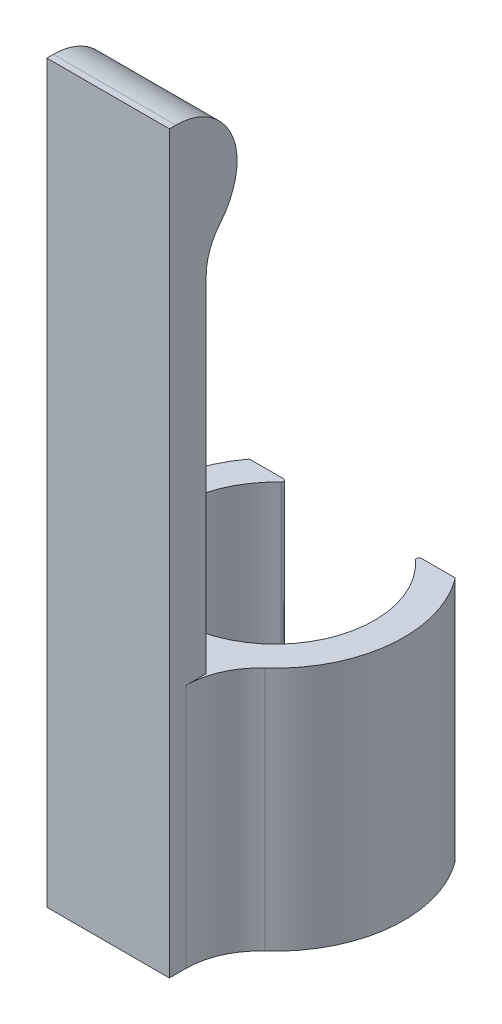
ISO-10303-21;
HEADER;
FILE_DESCRIPTION(('STEP AP214'),'2;1');
FILE_NAME('part.step','',(''),(''),'','','');
FILE_SCHEMA(('AUTOMOTIVE_DESIGN { 1 0 10303 214 1 1 1 1 }'));
ENDSEC;
DATA;
#1=APPLICATION_CONTEXT('core data for automotive mechanical design processes');
#2=APPLICATION_PROTOCOL_DEFINITION('international standard','automotive_design',2000,#1);
#3=PRODUCT_CONTEXT('',#1,'mechanical');
#4=PRODUCT('Part','Part','',(#3));
#5=PRODUCT_RELATED_PRODUCT_CATEGORY('part','',(#4));
#6=PRODUCT_DEFINITION_FORMATION('','',#4);
#7=PRODUCT_DEFINITION_CONTEXT('part definition',#1,'design');
#8=PRODUCT_DEFINITION('design','',#6,#7);
#9=PRODUCT_DEFINITION_SHAPE('','',#8);
#10=(LENGTH_UNIT() NAMED_UNIT(*) SI_UNIT(.MILLI.,.METRE.));
#11=(NAMED_UNIT(*) PLANE_ANGLE_UNIT() SI_UNIT($,.RADIAN.));
#12=(NAMED_UNIT(*) SI_UNIT($,.STERADIAN.) SOLID_ANGLE_UNIT());
#13=UNCERTAINTY_MEASURE_WITH_UNIT(LENGTH_MEASURE(1.E-05),#10,'distance_accuracy_value','');
#14=(GEOMETRIC_REPRESENTATION_CONTEXT(3) GLOBAL_UNCERTAINTY_ASSIGNED_CONTEXT((#13)) GLOBAL_UNIT_ASSIGNED_CONTEXT((#10,
#11,#12)) REPRESENTATION_CONTEXT('',''));
#15=CARTESIAN_POINT('',(0.,0.,0.));
#16=DIRECTION('',(0.,0.,1.));
#17=DIRECTION('',(1.,0.,0.));
#18=AXIS2_PLACEMENT_3D('',#15,#16,#17);
#19=CARTESIAN_POINT('',(0.,30.,5.31654632815485));
#20=DIRECTION('',(0.,0.,-1.));
#21=DIRECTION('',(-1.,0.,0.));
#22=AXIS2_PLACEMENT_3D('',#19,#20,#21);
#23=PLANE('',#22);
#24=DIRECTION('',(0.,-1.,0.));
#25=VECTOR('',#24,1.);
#26=CARTESIAN_POINT('',(-2.5,30.,5.31654632815485));
#27=LINE('',#26,#25);
#28=CARTESIAN_POINT('',(-2.5,24.0403961705515,5.31654632815485));
#29=VERTEX_POINT('',#28);
#30=CARTESIAN_POINT('',(-2.5,10.,5.31654632815485));
#31=VERTEX_POINT('',#30);
#32=EDGE_CURVE('E214',#29,#31,#27,.T.);
#33=ORIENTED_EDGE('',*,*,#32,.F.);
#34=DIRECTION('',(1.,0.,0.));
#35=VECTOR('',#34,1.);
#36=CARTESIAN_POINT('',(0.,24.0403961705515,5.31654632815485));
#37=LINE('',#36,#35);
#38=CARTESIAN_POINT('',(2.5,24.0403961705515,5.31654632815485));
#39=VERTEX_POINT('',#38);
#40=EDGE_CURVE('E300',#29,#39,#37,.T.);
#41=ORIENTED_EDGE('',*,*,#40,.T.);
#42=DIRECTION('',(0.,-1.,0.));
#43=VECTOR('',#42,1.);
#44=CARTESIAN_POINT('',(2.5,30.,5.31654632815485));
#45=LINE('',#44,#43);
#46=CARTESIAN_POINT('',(2.5,10.,5.31654632815485));
#47=VERTEX_POINT('',#46);
#48=EDGE_CURVE('E208',#39,#47,#45,.T.);
#49=ORIENTED_EDGE('',*,*,#48,.T.);
#50=DIRECTION('',(-1.,0.,0.));
#51=VECTOR('',#50,1.);
#52=CARTESIAN_POINT('',(0.,10.,5.31654632815485));
#53=LINE('',#52,#51);
#54=EDGE_CURVE('E225',#47,#31,#53,.T.);
#55=ORIENTED_EDGE('',*,*,#54,.T.);
#56=EDGE_LOOP('',(#33,#41,#49,#55));
#57=FACE_BOUND('',#56,.T.);
#58=ADVANCED_FACE('F43',(#57),#23,.T.);
#59=CARTESIAN_POINT('',(0.,10.,0.));
#60=DIRECTION('',(0.,1.,0.));
#61=DIRECTION('',(0.,0.,1.));
#62=AXIS2_PLACEMENT_3D('',#59,#60,#61);
#63=PLANE('',#62);
#64=CARTESIAN_POINT('',(0.,10.,0.));
#65=DIRECTION('',(0.,1.,0.));
#66=DIRECTION('',(0.,0.,1.));
#67=AXIS2_PLACEMENT_3D('',#64,#65,#66);
#68=CIRCLE('',#67,5.25);
#69=CARTESIAN_POINT('',(3.5,10.,3.91311896062463));
#70=VERTEX_POINT('',#69);
#71=CARTESIAN_POINT('',(4.2302754596716,10.,-3.10922330097087));
#72=VERTEX_POINT('',#71);
#73=EDGE_CURVE('E230',#70,#72,#68,.T.);
#74=ORIENTED_EDGE('',*,*,#73,.T.);
#75=CARTESIAN_POINT('',(4.14969878424928,10.,-3.05));
#76=DIRECTION('',(0.,1.,0.));
#77=DIRECTION('',(0.,0.,1.));
#78=AXIS2_PLACEMENT_3D('',#75,#76,#77);
#79=CIRCLE('',#78,0.1);
#80=CARTESIAN_POINT('',(4.14969878424928,10.,-3.15));
#81=VERTEX_POINT('',#80);
#82=EDGE_CURVE('E355',#72,#81,#79,.T.);
#83=ORIENTED_EDGE('',*,*,#82,.T.);
#84=DIRECTION('',(1.,0.,0.));
#85=VECTOR('',#84,1.);
#86=CARTESIAN_POINT('',(0.,10.,-3.15));
#87=LINE('',#86,#85);
#88=CARTESIAN_POINT('',(2.81424945589406,10.,-3.15));
#89=VERTEX_POINT('',#88);
#90=EDGE_CURVE('E234',#89,#81,#87,.T.);
#91=ORIENTED_EDGE('',*,*,#90,.F.);
#92=CARTESIAN_POINT('',(2.81424945589406,10.,-3.05));
#93=DIRECTION('',(0.,1.,0.));
#94=DIRECTION('',(0.,0.,1.));
#95=AXIS2_PLACEMENT_3D('',#92,#93,#94);
#96=CIRCLE('',#95,0.1);
#97=CARTESIAN_POINT('',(2.746436215993,10.,-2.97650602409639));
#98=VERTEX_POINT('',#97);
#99=EDGE_CURVE('E347',#89,#98,#96,.T.);
#100=ORIENTED_EDGE('',*,*,#99,.T.);
#101=CARTESIAN_POINT('',(0.,10.,0.));
#102=DIRECTION('',(0.,1.,0.));
#103=DIRECTION('',(0.,0.,1.));
#104=AXIS2_PLACEMENT_3D('',#101,#102,#103);
#105=CIRCLE('',#104,4.05);
#106=CARTESIAN_POINT('',(-2.746436215993,10.,-2.97650602409639));
#107=VERTEX_POINT('',#106);
#108=EDGE_CURVE('E240',#107,#98,#105,.T.);
#109=ORIENTED_EDGE('',*,*,#108,.F.);
#110=CARTESIAN_POINT('',(-2.81424945589406,10.,-3.05));
#111=DIRECTION('',(0.,1.,0.));
#112=DIRECTION('',(0.,0.,1.));
#113=AXIS2_PLACEMENT_3D('',#110,#111,#112);
#114=CIRCLE('',#113,0.1);
#115=CARTESIAN_POINT('',(-2.81424945589406,10.,-3.15));
#116=VERTEX_POINT('',#115);
#117=EDGE_CURVE('E350',#107,#116,#114,.T.);
#118=ORIENTED_EDGE('',*,*,#117,.T.);
#119=DIRECTION('',(-1.,0.,0.));
#120=VECTOR('',#119,1.);
#121=CARTESIAN_POINT('',(0.,10.,-3.15));
#122=LINE('',#121,#120);
#123=CARTESIAN_POINT('',(-4.14969878424928,10.,-3.15));
#124=VERTEX_POINT('',#123);
#125=EDGE_CURVE('E244',#116,#124,#122,.T.);
#126=ORIENTED_EDGE('',*,*,#125,.T.);
#127=CARTESIAN_POINT('',(-4.14969878424928,10.,-3.05));
#128=DIRECTION('',(0.,1.,0.));
#129=DIRECTION('',(0.,0.,1.));
#130=AXIS2_PLACEMENT_3D('',#127,#128,#129);
#131=CIRCLE('',#130,0.1);
#132=CARTESIAN_POINT('',(-4.2302754596716,10.,-3.10922330097087));
#133=VERTEX_POINT('',#132);
#134=EDGE_CURVE('E59',#124,#133,#131,.T.);
#135=ORIENTED_EDGE('',*,*,#134,.T.);
#136=CARTESIAN_POINT('',(-3.5,10.,3.91311896062463));
#137=VERTEX_POINT('',#136);
#138=EDGE_CURVE('E236',#133,#137,#68,.T.);
#139=ORIENTED_EDGE('',*,*,#138,.T.);
#140=CARTESIAN_POINT('',(-5.5,10.,6.14918693812442));
#141=DIRECTION('',(0.,1.,0.));
#142=DIRECTION('',(0.,0.,1.));
#143=AXIS2_PLACEMENT_3D('',#140,#141,#142);
#144=CIRCLE('',#143,3.);
#145=CARTESIAN_POINT('',(-2.5,10.,6.14918693812442));
#146=VERTEX_POINT('',#145);
#147=EDGE_CURVE('E297',#137,#146,#144,.F.);
#148=ORIENTED_EDGE('',*,*,#147,.T.);
#149=DIRECTION('',(0.,0.,-1.));
#150=VECTOR('',#149,1.);
#151=CARTESIAN_POINT('',(-2.5,10.,0.));
#152=LINE('',#151,#150);
#153=EDGE_CURVE('E217',#146,#31,#152,.T.);
#154=ORIENTED_EDGE('',*,*,#153,.T.);
#155=ORIENTED_EDGE('',*,*,#54,.F.);
#156=DIRECTION('',(0.,0.,1.));
#157=VECTOR('',#156,1.);
#158=CARTESIAN_POINT('',(2.5,10.,0.));
#159=LINE('',#158,#157);
#160=CARTESIAN_POINT('',(2.5,10.,6.14918693812442));
#161=VERTEX_POINT('',#160);
#162=EDGE_CURVE('E221',#47,#161,#159,.T.);
#163=ORIENTED_EDGE('',*,*,#162,.T.);
#164=CARTESIAN_POINT('',(5.5,10.,6.14918693812442));
#165=DIRECTION('',(0.,1.,0.));
#166=DIRECTION('',(0.,0.,1.));
#167=AXIS2_PLACEMENT_3D('',#164,#165,#166);
#168=CIRCLE('',#167,3.);
#169=EDGE_CURVE('E290',#161,#70,#168,.F.);
#170=ORIENTED_EDGE('',*,*,#169,.T.);
#171=EDGE_LOOP('',(#74,#83,#91,#100,#109,#118,#126,#135,#139,#148,#154,#155,#163,#170));
#172=FACE_BOUND('',#171,.T.);
#173=ADVANCED_FACE('F386',(#172),#63,.T.);
#174=CARTESIAN_POINT('',(0.,10.,0.));
#175=DIRECTION('',(0.,-1.,0.));
#176=DIRECTION('',(0.,0.,-1.));
#177=AXIS2_PLACEMENT_3D('',#174,#175,#176);
#178=CYLINDRICAL_SURFACE('',#177,5.25);
#179=CARTESIAN_POINT('',(0.,0.,0.));
#180=DIRECTION('',(0.,1.,0.));
#181=DIRECTION('',(0.,0.,1.));
#182=AXIS2_PLACEMENT_3D('',#179,#180,#181);
#183=CIRCLE('',#182,5.25);
#184=CARTESIAN_POINT('',(3.5,0.,3.91311896062463));
#185=VERTEX_POINT('',#184);
#186=CARTESIAN_POINT('',(4.2302754596716,0.,-3.10922330097087));
#187=VERTEX_POINT('',#186);
#188=EDGE_CURVE('E247',#185,#187,#183,.T.);
#189=ORIENTED_EDGE('',*,*,#188,.T.);
#190=DIRECTION('',(0.,-1.,0.));
#191=VECTOR('',#190,1.);
#192=CARTESIAN_POINT('',(4.2302754596716,10.,-3.10922330097087));
#193=LINE('',#192,#191);
#194=EDGE_CURVE('E344',#187,#72,#193,.F.);
#195=ORIENTED_EDGE('',*,*,#194,.T.);
#196=ORIENTED_EDGE('',*,*,#73,.F.);
#197=DIRECTION('',(0.,-1.,0.));
#198=VECTOR('',#197,1.);
#199=CARTESIAN_POINT('',(3.5,10.,3.91311896062463));
#200=LINE('',#199,#198);
#201=EDGE_CURVE('E272',#70,#185,#200,.T.);
#202=ORIENTED_EDGE('',*,*,#201,.T.);
#203=EDGE_LOOP('',(#189,#195,#196,#202));
#204=FACE_BOUND('',#203,.T.);
#205=ADVANCED_FACE('F417',(#204),#178,.T.);
#206=CARTESIAN_POINT('',(0.,10.,-3.15));
#207=DIRECTION('',(0.,0.,-1.));
#208=DIRECTION('',(-1.,0.,0.));
#209=AXIS2_PLACEMENT_3D('',#206,#207,#208);
#210=PLANE('',#209);
#211=ORIENTED_EDGE('',*,*,#90,.T.);
#212=DIRECTION('',(0.,1.,0.));
#213=VECTOR('',#212,1.);
#214=CARTESIAN_POINT('',(4.14969878424928,0.,-3.15));
#215=LINE('',#214,#213);
#216=CARTESIAN_POINT('',(4.14969878424928,0.,-3.15));
#217=VERTEX_POINT('',#216);
#218=EDGE_CURVE('E328',#81,#217,#215,.F.);
#219=ORIENTED_EDGE('',*,*,#218,.T.);
#220=DIRECTION('',(1.,0.,0.));
#221=VECTOR('',#220,1.);
#222=CARTESIAN_POINT('',(0.,0.,-3.15));
#223=LINE('',#222,#221);
#224=CARTESIAN_POINT('',(2.81424945589406,0.,-3.15));
#225=VERTEX_POINT('',#224);
#226=EDGE_CURVE('E251',#225,#217,#223,.T.);
#227=ORIENTED_EDGE('',*,*,#226,.F.);
#228=DIRECTION('',(0.,-1.,0.));
#229=VECTOR('',#228,1.);
#230=CARTESIAN_POINT('',(2.81424945589406,10.,-3.15));
#231=LINE('',#230,#229);
#232=EDGE_CURVE('E325',#225,#89,#231,.F.);
#233=ORIENTED_EDGE('',*,*,#232,.T.);
#234=EDGE_LOOP('',(#211,#219,#227,#233));
#235=FACE_BOUND('',#234,.T.);
#236=ADVANCED_FACE('F462',(#235),#210,.T.);
#237=CARTESIAN_POINT('',(0.,10.,0.));
#238=DIRECTION('',(0.,-1.,0.));
#239=DIRECTION('',(0.,0.,-1.));
#240=AXIS2_PLACEMENT_3D('',#237,#238,#239);
#241=CYLINDRICAL_SURFACE('',#240,4.05);
#242=CARTESIAN_POINT('',(0.,0.,0.));
#243=DIRECTION('',(0.,1.,0.));
#244=DIRECTION('',(0.,0.,1.));
#245=AXIS2_PLACEMENT_3D('',#242,#243,#244);
#246=CIRCLE('',#245,4.05);
#247=CARTESIAN_POINT('',(-2.746436215993,0.,-2.97650602409639));
#248=VERTEX_POINT('',#247);
#249=CARTESIAN_POINT('',(2.746436215993,0.,-2.97650602409639));
#250=VERTEX_POINT('',#249);
#251=EDGE_CURVE('E255',#248,#250,#246,.T.);
#252=ORIENTED_EDGE('',*,*,#251,.F.);
#253=DIRECTION('',(0.,-1.,0.));
#254=VECTOR('',#253,1.);
#255=CARTESIAN_POINT('',(-2.746436215993,10.,-2.97650602409639));
#256=LINE('',#255,#254);
#257=EDGE_CURVE('E11',#248,#107,#256,.F.);
#258=ORIENTED_EDGE('',*,*,#257,.T.);
#259=ORIENTED_EDGE('',*,*,#108,.T.);
#260=DIRECTION('',(0.,-1.,0.));
#261=VECTOR('',#260,1.);
#262=CARTESIAN_POINT('',(2.746436215993,10.,-2.97650602409639));
#263=LINE('',#262,#261);
#264=EDGE_CURVE('E52',#98,#250,#263,.T.);
#265=ORIENTED_EDGE('',*,*,#264,.T.);
#266=EDGE_LOOP('',(#252,#258,#259,#265));
#267=FACE_BOUND('',#266,.T.);
#268=ADVANCED_FACE('F372',(#267),#241,.F.);
#269=CARTESIAN_POINT('',(0.,10.,-3.15));
#270=DIRECTION('',(0.,0.,1.));
#271=DIRECTION('',(1.,0.,0.));
#272=AXIS2_PLACEMENT_3D('',#269,#270,#271);
#273=PLANE('',#272);
#274=DIRECTION('',(-1.,0.,0.));
#275=VECTOR('',#274,1.);
#276=CARTESIAN_POINT('',(0.,0.,-3.15));
#277=LINE('',#276,#275);
#278=CARTESIAN_POINT('',(-2.81424945589406,0.,-3.15));
#279=VERTEX_POINT('',#278);
#280=CARTESIAN_POINT('',(-4.14969878424928,0.,-3.15));
#281=VERTEX_POINT('',#280);
#282=EDGE_CURVE('E259',#279,#281,#277,.T.);
#283=ORIENTED_EDGE('',*,*,#282,.T.);
#284=DIRECTION('',(0.,-1.,0.));
#285=VECTOR('',#284,1.);
#286=CARTESIAN_POINT('',(-4.14969878424928,10.,-3.15));
#287=LINE('',#286,#285);
#288=EDGE_CURVE('E67',#281,#124,#287,.F.);
#289=ORIENTED_EDGE('',*,*,#288,.T.);
#290=ORIENTED_EDGE('',*,*,#125,.F.);
#291=DIRECTION('',(0.,1.,0.));
#292=VECTOR('',#291,1.);
#293=CARTESIAN_POINT('',(-2.81424945589406,0.,-3.15));
#294=LINE('',#293,#292);
#295=EDGE_CURVE('E362',#116,#279,#294,.F.);
#296=ORIENTED_EDGE('',*,*,#295,.T.);
#297=EDGE_LOOP('',(#283,#289,#290,#296));
#298=FACE_BOUND('',#297,.T.);
#299=ADVANCED_FACE('F385',(#298),#273,.F.);
#300=ORIENTED_EDGE('',*,*,#138,.F.);
#301=DIRECTION('',(0.,-1.,0.));
#302=VECTOR('',#301,1.);
#303=CARTESIAN_POINT('',(-4.2302754596716,10.,-3.10922330097087));
#304=LINE('',#303,#302);
#305=CARTESIAN_POINT('',(-4.2302754596716,0.,-3.10922330097087));
#306=VERTEX_POINT('',#305);
#307=EDGE_CURVE('E358',#133,#306,#304,.T.);
#308=ORIENTED_EDGE('',*,*,#307,.T.);
#309=CARTESIAN_POINT('',(-3.5,0.,3.91311896062463));
#310=VERTEX_POINT('',#309);
#311=EDGE_CURVE('E235',#306,#310,#183,.T.);
#312=ORIENTED_EDGE('',*,*,#311,.T.);
#313=DIRECTION('',(0.,-1.,0.));
#314=VECTOR('',#313,1.);
#315=CARTESIAN_POINT('',(-3.5,10.,3.91311896062463));
#316=LINE('',#315,#314);
#317=EDGE_CURVE('E283',#310,#137,#316,.F.);
#318=ORIENTED_EDGE('',*,*,#317,.T.);
#319=EDGE_LOOP('',(#300,#308,#312,#318));
#320=FACE_BOUND('',#319,.T.);
#321=ADVANCED_FACE('F392',(#320),#178,.T.);
#322=CARTESIAN_POINT('',(0.,0.,0.));
#323=DIRECTION('',(0.,1.,0.));
#324=DIRECTION('',(0.,0.,1.));
#325=AXIS2_PLACEMENT_3D('',#322,#323,#324);
#326=PLANE('',#325);
#327=ORIENTED_EDGE('',*,*,#226,.T.);
#328=CARTESIAN_POINT('',(4.14969878424928,0.,-3.05));
#329=DIRECTION('',(0.,1.,0.));
#330=DIRECTION('',(0.,0.,1.));
#331=AXIS2_PLACEMENT_3D('',#328,#329,#330);
#332=CIRCLE('',#331,0.1);
#333=EDGE_CURVE('E341',#217,#187,#332,.F.);
#334=ORIENTED_EDGE('',*,*,#333,.T.);
#335=ORIENTED_EDGE('',*,*,#188,.F.);
#336=CARTESIAN_POINT('',(5.5,0.,6.14918693812442));
#337=DIRECTION('',(0.,1.,0.));
#338=DIRECTION('',(0.,0.,1.));
#339=AXIS2_PLACEMENT_3D('',#336,#337,#338);
#340=CIRCLE('',#339,3.);
#341=CARTESIAN_POINT('',(2.5,0.,6.14918693812442));
#342=VERTEX_POINT('',#341);
#343=EDGE_CURVE('E287',#185,#342,#340,.T.);
#344=ORIENTED_EDGE('',*,*,#343,.T.);
#345=DIRECTION('',(0.,0.,-1.));
#346=VECTOR('',#345,1.);
#347=CARTESIAN_POINT('',(2.5,0.,6.81654632815484));
#348=LINE('',#347,#346);
#349=CARTESIAN_POINT('',(2.5,0.,6.81654632815484));
#350=VERTEX_POINT('',#349);
#351=EDGE_CURVE('E264',#350,#342,#348,.T.);
#352=ORIENTED_EDGE('',*,*,#351,.F.);
#353=DIRECTION('',(1.,0.,0.));
#354=VECTOR('',#353,1.);
#355=CARTESIAN_POINT('',(-2.5,0.,6.81654632815485));
#356=LINE('',#355,#354);
#357=CARTESIAN_POINT('',(-2.5,0.,6.81654632815485));
#358=VERTEX_POINT('',#357);
#359=EDGE_CURVE('E229',#358,#350,#356,.T.);
#360=ORIENTED_EDGE('',*,*,#359,.F.);
#361=DIRECTION('',(0.,0.,1.));
#362=VECTOR('',#361,1.);
#363=CARTESIAN_POINT('',(-2.5,0.,4.61654632815485));
#364=LINE('',#363,#362);
#365=CARTESIAN_POINT('',(-2.5,0.,6.14918693812442));
#366=VERTEX_POINT('',#365);
#367=EDGE_CURVE('E195',#366,#358,#364,.T.);
#368=ORIENTED_EDGE('',*,*,#367,.F.);
#369=CARTESIAN_POINT('',(-5.5,0.,6.14918693812442));
#370=DIRECTION('',(0.,1.,0.));
#371=DIRECTION('',(0.,0.,1.));
#372=AXIS2_PLACEMENT_3D('',#369,#370,#371);
#373=CIRCLE('',#372,3.);
#374=EDGE_CURVE('E293',#366,#310,#373,.T.);
#375=ORIENTED_EDGE('',*,*,#374,.T.);
#376=ORIENTED_EDGE('',*,*,#311,.F.);
#377=CARTESIAN_POINT('',(-4.14969878424928,0.,-3.05));
#378=DIRECTION('',(0.,1.,0.));
#379=DIRECTION('',(0.,0.,1.));
#380=AXIS2_PLACEMENT_3D('',#377,#378,#379);
#381=CIRCLE('',#380,0.1);
#382=EDGE_CURVE('E338',#306,#281,#381,.F.);
#383=ORIENTED_EDGE('',*,*,#382,.T.);
#384=ORIENTED_EDGE('',*,*,#282,.F.);
#385=CARTESIAN_POINT('',(-2.81424945589406,0.,-3.05));
#386=DIRECTION('',(0.,1.,0.));
#387=DIRECTION('',(0.,0.,1.));
#388=AXIS2_PLACEMENT_3D('',#385,#386,#387);
#389=CIRCLE('',#388,0.1);
#390=EDGE_CURVE('E335',#279,#248,#389,.F.);
#391=ORIENTED_EDGE('',*,*,#390,.T.);
#392=ORIENTED_EDGE('',*,*,#251,.T.);
#393=CARTESIAN_POINT('',(2.81424945589406,0.,-3.05));
#394=DIRECTION('',(0.,1.,0.));
#395=DIRECTION('',(0.,0.,1.));
#396=AXIS2_PLACEMENT_3D('',#393,#394,#395);
#397=CIRCLE('',#396,0.1);
#398=EDGE_CURVE('E332',#250,#225,#397,.F.);
#399=ORIENTED_EDGE('',*,*,#398,.T.);
#400=EDGE_LOOP('',(#327,#334,#335,#344,#352,#360,#368,#375,#376,#383,#384,#391,#392,#399));
#401=FACE_BOUND('',#400,.T.);
#402=ADVANCED_FACE('F378',(#401),#326,.F.);
#403=CARTESIAN_POINT('',(2.5,10.,6.81654632815484));
#404=DIRECTION('',(-1.,0.,0.));
#405=DIRECTION('',(0.,0.,1.));
#406=AXIS2_PLACEMENT_3D('',#403,#404,#405);
#407=PLANE('',#406);
#408=CARTESIAN_POINT('',(2.5,27.551502834887,7.05));
#409=DIRECTION('',(-1.,0.,0.));
#410=DIRECTION('',(0.,0.,1.));
#411=AXIS2_PLACEMENT_3D('',#408,#409,#410);
#412=CIRCLE('',#411,3.);
#413=CARTESIAN_POINT('',(2.5,27.2424858255652,4.06595769333781));
#414=VERTEX_POINT('',#413);
#415=CARTESIAN_POINT('',(2.5,25.6363537452495,4.74084345172083));
#416=VERTEX_POINT('',#415);
#417=EDGE_CURVE('E431',#414,#416,#412,.T.);
#418=ORIENTED_EDGE('',*,*,#417,.F.);
#419=CARTESIAN_POINT('',(2.5,27.5,6.5526596155563));
#420=DIRECTION('',(-1.,0.,0.));
#421=DIRECTION('',(0.,0.,1.));
#422=AXIS2_PLACEMENT_3D('',#419,#420,#421);
#423=CIRCLE('',#422,2.5);
#424=CARTESIAN_POINT('',(2.5,30.,6.5526596155563));
#425=VERTEX_POINT('',#424);
#426=EDGE_CURVE('E311',#414,#425,#423,.F.);
#427=ORIENTED_EDGE('',*,*,#426,.T.);
#428=DIRECTION('',(0.,0.,-1.));
#429=VECTOR('',#428,1.);
#430=CARTESIAN_POINT('',(2.5,30.,0.));
#431=LINE('',#430,#429);
#432=CARTESIAN_POINT('',(2.5,30.,6.81654632815484));
#433=VERTEX_POINT('',#432);
#434=EDGE_CURVE('E205',#433,#425,#431,.T.);
#435=ORIENTED_EDGE('',*,*,#434,.F.);
#436=DIRECTION('',(0.,-1.,0.));
#437=VECTOR('',#436,1.);
#438=CARTESIAN_POINT('',(2.5,10.,6.81654632815484));
#439=LINE('',#438,#437);
#440=EDGE_CURVE('E200',#433,#350,#439,.T.);
#441=ORIENTED_EDGE('',*,*,#440,.T.);
#442=ORIENTED_EDGE('',*,*,#351,.T.);
#443=DIRECTION('',(0.,1.,0.));
#444=VECTOR('',#443,1.);
#445=CARTESIAN_POINT('',(2.5,10.,6.14918693812442));
#446=LINE('',#445,#444);
#447=EDGE_CURVE('E276',#342,#161,#446,.T.);
#448=ORIENTED_EDGE('',*,*,#447,.T.);
#449=ORIENTED_EDGE('',*,*,#162,.F.);
#450=ORIENTED_EDGE('',*,*,#48,.F.);
#451=CARTESIAN_POINT('',(2.5,24.0403961705515,2.81654632815484));
#452=DIRECTION('',(-1.,0.,0.));
#453=DIRECTION('',(0.,0.,1.));
#454=AXIS2_PLACEMENT_3D('',#451,#452,#453);
#455=CIRCLE('',#454,2.5);
#456=EDGE_CURVE('E319',#39,#416,#455,.T.);
#457=ORIENTED_EDGE('',*,*,#456,.T.);
#458=EDGE_LOOP('',(#418,#427,#435,#441,#442,#448,#449,#450,#457));
#459=FACE_BOUND('',#458,.T.);
#460=ADVANCED_FACE('F409',(#459),#407,.F.);
#461=CARTESIAN_POINT('',(-2.5,10.,6.81654632815485));
#462=DIRECTION('',(0.,0.,-1.));
#463=DIRECTION('',(-1.,0.,0.));
#464=AXIS2_PLACEMENT_3D('',#461,#462,#463);
#465=PLANE('',#464);
#466=ORIENTED_EDGE('',*,*,#359,.T.);
#467=ORIENTED_EDGE('',*,*,#440,.F.);
#468=DIRECTION('',(1.,0.,0.));
#469=VECTOR('',#468,1.);
#470=CARTESIAN_POINT('',(0.,30.,6.81654632815485));
#471=LINE('',#470,#469);
#472=CARTESIAN_POINT('',(-2.5,30.,6.81654632815485));
#473=VERTEX_POINT('',#472);
#474=EDGE_CURVE('E181',#473,#433,#471,.T.);
#475=ORIENTED_EDGE('',*,*,#474,.F.);
#476=DIRECTION('',(0.,-1.,0.));
#477=VECTOR('',#476,1.);
#478=CARTESIAN_POINT('',(-2.5,10.,6.81654632815485));
#479=LINE('',#478,#477);
#480=EDGE_CURVE('E191',#473,#358,#479,.T.);
#481=ORIENTED_EDGE('',*,*,#480,.T.);
#482=EDGE_LOOP('',(#466,#467,#475,#481));
#483=FACE_BOUND('',#482,.T.);
#484=ADVANCED_FACE('F202',(#483),#465,.F.);
#485=CARTESIAN_POINT('',(-2.5,10.,4.61654632815485));
#486=DIRECTION('',(1.,0.,0.));
#487=DIRECTION('',(0.,0.,-1.));
#488=AXIS2_PLACEMENT_3D('',#485,#486,#487);
#489=PLANE('',#488);
#490=DIRECTION('',(0.,0.,1.));
#491=VECTOR('',#490,1.);
#492=CARTESIAN_POINT('',(-2.5,30.,0.));
#493=LINE('',#492,#491);
#494=CARTESIAN_POINT('',(-2.5,30.,6.5526596155563));
#495=VERTEX_POINT('',#494);
#496=EDGE_CURVE('E176',#495,#473,#493,.T.);
#497=ORIENTED_EDGE('',*,*,#496,.F.);
#498=CARTESIAN_POINT('',(-2.5,27.5,6.5526596155563));
#499=DIRECTION('',(1.,0.,0.));
#500=DIRECTION('',(0.,0.,-1.));
#501=AXIS2_PLACEMENT_3D('',#498,#499,#500);
#502=CIRCLE('',#501,2.5);
#503=CARTESIAN_POINT('',(-2.5,27.2424858255652,4.06595769333781));
#504=VERTEX_POINT('',#503);
#505=EDGE_CURVE('E316',#495,#504,#502,.F.);
#506=ORIENTED_EDGE('',*,*,#505,.T.);
#507=CARTESIAN_POINT('',(-2.5,27.551502834887,7.05));
#508=DIRECTION('',(-1.,0.,0.));
#509=DIRECTION('',(0.,0.,1.));
#510=AXIS2_PLACEMENT_3D('',#507,#508,#509);
#511=CIRCLE('',#510,3.);
#512=CARTESIAN_POINT('',(-2.5,25.6363537452495,4.74084345172083));
#513=VERTEX_POINT('',#512);
#514=EDGE_CURVE('E188',#504,#513,#511,.T.);
#515=ORIENTED_EDGE('',*,*,#514,.T.);
#516=CARTESIAN_POINT('',(-2.5,24.0403961705515,2.81654632815484));
#517=DIRECTION('',(1.,0.,0.));
#518=DIRECTION('',(0.,0.,-1.));
#519=AXIS2_PLACEMENT_3D('',#516,#517,#518);
#520=CIRCLE('',#519,2.5);
#521=EDGE_CURVE('E322',#513,#29,#520,.T.);
#522=ORIENTED_EDGE('',*,*,#521,.T.);
#523=ORIENTED_EDGE('',*,*,#32,.T.);
#524=ORIENTED_EDGE('',*,*,#153,.F.);
#525=DIRECTION('',(0.,1.,0.));
#526=VECTOR('',#525,1.);
#527=CARTESIAN_POINT('',(-2.5,0.,6.14918693812442));
#528=LINE('',#527,#526);
#529=EDGE_CURVE('E280',#146,#366,#528,.F.);
#530=ORIENTED_EDGE('',*,*,#529,.T.);
#531=ORIENTED_EDGE('',*,*,#367,.T.);
#532=ORIENTED_EDGE('',*,*,#480,.F.);
#533=EDGE_LOOP('',(#497,#506,#515,#522,#523,#524,#530,#531,#532));
#534=FACE_BOUND('',#533,.T.);
#535=ADVANCED_FACE('F192',(#534),#489,.F.);
#536=CARTESIAN_POINT('',(5.5,10.,6.14918693812442));
#537=DIRECTION('',(0.,-1.,0.));
#538=DIRECTION('',(0.,0.,-1.));
#539=AXIS2_PLACEMENT_3D('',#536,#537,#538);
#540=CYLINDRICAL_SURFACE('',#539,3.);
#541=ORIENTED_EDGE('',*,*,#169,.F.);
#542=ORIENTED_EDGE('',*,*,#447,.F.);
#543=ORIENTED_EDGE('',*,*,#343,.F.);
#544=ORIENTED_EDGE('',*,*,#201,.F.);
#545=EDGE_LOOP('',(#541,#542,#543,#544));
#546=FACE_BOUND('',#545,.T.);
#547=ADVANCED_FACE('F420',(#546),#540,.F.);
#548=CARTESIAN_POINT('',(-5.5,10.,6.14918693812442));
#549=DIRECTION('',(0.,-1.,0.));
#550=DIRECTION('',(0.,0.,-1.));
#551=AXIS2_PLACEMENT_3D('',#548,#549,#550);
#552=CYLINDRICAL_SURFACE('',#551,3.);
#553=ORIENTED_EDGE('',*,*,#147,.F.);
#554=ORIENTED_EDGE('',*,*,#317,.F.);
#555=ORIENTED_EDGE('',*,*,#374,.F.);
#556=ORIENTED_EDGE('',*,*,#529,.F.);
#557=EDGE_LOOP('',(#553,#554,#555,#556));
#558=FACE_BOUND('',#557,.T.);
#559=ADVANCED_FACE('F399',(#558),#552,.F.);
#560=CARTESIAN_POINT('',(0.,30.,0.));
#561=DIRECTION('',(0.,1.,0.));
#562=DIRECTION('',(0.,0.,1.));
#563=AXIS2_PLACEMENT_3D('',#560,#561,#562);
#564=PLANE('',#563);
#565=ORIENTED_EDGE('',*,*,#434,.T.);
#566=DIRECTION('',(-1.,0.,0.));
#567=VECTOR('',#566,1.);
#568=CARTESIAN_POINT('',(-2.5,30.,6.5526596155563));
#569=LINE('',#568,#567);
#570=EDGE_CURVE('E184',#425,#495,#569,.T.);
#571=ORIENTED_EDGE('',*,*,#570,.T.);
#572=ORIENTED_EDGE('',*,*,#496,.T.);
#573=ORIENTED_EDGE('',*,*,#474,.T.);
#574=EDGE_LOOP('',(#565,#571,#572,#573));
#575=FACE_BOUND('',#574,.T.);
#576=ADVANCED_FACE('F179',(#575),#564,.T.);
#577=CARTESIAN_POINT('',(-2.5,27.551502834887,7.05));
#578=DIRECTION('',(1.,0.,0.));
#579=DIRECTION('',(0.,0.,-1.));
#580=AXIS2_PLACEMENT_3D('',#577,#578,#579);
#581=CYLINDRICAL_SURFACE('',#580,3.);
#582=ORIENTED_EDGE('',*,*,#417,.T.);
#583=DIRECTION('',(1.,0.,0.));
#584=VECTOR('',#583,1.);
#585=CARTESIAN_POINT('',(-2.5,25.6363537452495,4.74084345172083));
#586=LINE('',#585,#584);
#587=EDGE_CURVE('E308',#416,#513,#586,.F.);
#588=ORIENTED_EDGE('',*,*,#587,.T.);
#589=ORIENTED_EDGE('',*,*,#514,.F.);
#590=DIRECTION('',(1.,0.,0.));
#591=VECTOR('',#590,1.);
#592=CARTESIAN_POINT('',(-2.5,27.2424858255652,4.06595769333781));
#593=LINE('',#592,#591);
#594=EDGE_CURVE('E304',#504,#414,#593,.T.);
#595=ORIENTED_EDGE('',*,*,#594,.T.);
#596=EDGE_LOOP('',(#582,#588,#589,#595));
#597=FACE_BOUND('',#596,.T.);
#598=ADVANCED_FACE('F428',(#597),#581,.T.);
#599=CARTESIAN_POINT('',(-2.5,24.0403961705515,2.81654632815484));
#600=DIRECTION('',(1.,0.,0.));
#601=DIRECTION('',(0.,0.,-1.));
#602=AXIS2_PLACEMENT_3D('',#599,#600,#601);
#603=CYLINDRICAL_SURFACE('',#602,2.5);
#604=ORIENTED_EDGE('',*,*,#521,.F.);
#605=ORIENTED_EDGE('',*,*,#587,.F.);
#606=ORIENTED_EDGE('',*,*,#456,.F.);
#607=ORIENTED_EDGE('',*,*,#40,.F.);
#608=EDGE_LOOP('',(#604,#605,#606,#607));
#609=FACE_BOUND('',#608,.T.);
#610=ADVANCED_FACE('F435',(#609),#603,.F.);
#611=CARTESIAN_POINT('',(-2.5,27.5,6.5526596155563));
#612=DIRECTION('',(1.,0.,0.));
#613=DIRECTION('',(0.,0.,-1.));
#614=AXIS2_PLACEMENT_3D('',#611,#612,#613);
#615=CYLINDRICAL_SURFACE('',#614,2.5);
#616=ORIENTED_EDGE('',*,*,#505,.F.);
#617=ORIENTED_EDGE('',*,*,#570,.F.);
#618=ORIENTED_EDGE('',*,*,#426,.F.);
#619=ORIENTED_EDGE('',*,*,#594,.F.);
#620=EDGE_LOOP('',(#616,#617,#618,#619));
#621=FACE_BOUND('',#620,.T.);
#622=ADVANCED_FACE('F422',(#621),#615,.T.);
#623=CARTESIAN_POINT('',(4.14969878424928,10.,-3.05));
#624=DIRECTION('',(0.,-1.,0.));
#625=DIRECTION('',(0.,0.,-1.));
#626=AXIS2_PLACEMENT_3D('',#623,#624,#625);
#627=CYLINDRICAL_SURFACE('',#626,0.1);
#628=ORIENTED_EDGE('',*,*,#82,.F.);
#629=ORIENTED_EDGE('',*,*,#194,.F.);
#630=ORIENTED_EDGE('',*,*,#333,.F.);
#631=ORIENTED_EDGE('',*,*,#218,.F.);
#632=EDGE_LOOP('',(#628,#629,#630,#631));
#633=FACE_BOUND('',#632,.T.);
#634=ADVANCED_FACE('F442',(#633),#627,.T.);
#635=CARTESIAN_POINT('',(-4.14969878424928,10.,-3.05));
#636=DIRECTION('',(0.,-1.,0.));
#637=DIRECTION('',(0.,0.,-1.));
#638=AXIS2_PLACEMENT_3D('',#635,#636,#637);
#639=CYLINDRICAL_SURFACE('',#638,0.1);
#640=ORIENTED_EDGE('',*,*,#134,.F.);
#641=ORIENTED_EDGE('',*,*,#288,.F.);
#642=ORIENTED_EDGE('',*,*,#382,.F.);
#643=ORIENTED_EDGE('',*,*,#307,.F.);
#644=EDGE_LOOP('',(#640,#641,#642,#643));
#645=FACE_BOUND('',#644,.T.);
#646=ADVANCED_FACE('F389',(#645),#639,.T.);
#647=CARTESIAN_POINT('',(-2.81424945589406,10.,-3.05));
#648=DIRECTION('',(0.,-1.,0.));
#649=DIRECTION('',(0.,0.,-1.));
#650=AXIS2_PLACEMENT_3D('',#647,#648,#649);
#651=CYLINDRICAL_SURFACE('',#650,0.1);
#652=ORIENTED_EDGE('',*,*,#117,.F.);
#653=ORIENTED_EDGE('',*,*,#257,.F.);
#654=ORIENTED_EDGE('',*,*,#390,.F.);
#655=ORIENTED_EDGE('',*,*,#295,.F.);
#656=EDGE_LOOP('',(#652,#653,#654,#655));
#657=FACE_BOUND('',#656,.T.);
#658=ADVANCED_FACE('F384',(#657),#651,.T.);
#659=CARTESIAN_POINT('',(2.81424945589406,10.,-3.05));
#660=DIRECTION('',(0.,-1.,0.));
#661=DIRECTION('',(0.,0.,-1.));
#662=AXIS2_PLACEMENT_3D('',#659,#660,#661);
#663=CYLINDRICAL_SURFACE('',#662,0.1);
#664=ORIENTED_EDGE('',*,*,#99,.F.);
#665=ORIENTED_EDGE('',*,*,#232,.F.);
#666=ORIENTED_EDGE('',*,*,#398,.F.);
#667=ORIENTED_EDGE('',*,*,#264,.F.);
#668=EDGE_LOOP('',(#664,#665,#666,#667));
#669=FACE_BOUND('',#668,.T.);
#670=ADVANCED_FACE('F45',(#669),#663,.T.);
#671=CLOSED_SHELL('',(#58,#173,#205,#236,#268,#299,#321,#402,#460,#484,#535,#547,#559,#576,#598,
#610,#622,#634,#646,#658,#670));
#672=MANIFOLD_SOLID_BREP('B2',#671);
#673=ADVANCED_BREP_SHAPE_REPRESENTATION('',(#18,#672),#14);
#674=SHAPE_DEFINITION_REPRESENTATION(#9,#673);
ENDSEC;
END-ISO-10303-21;
